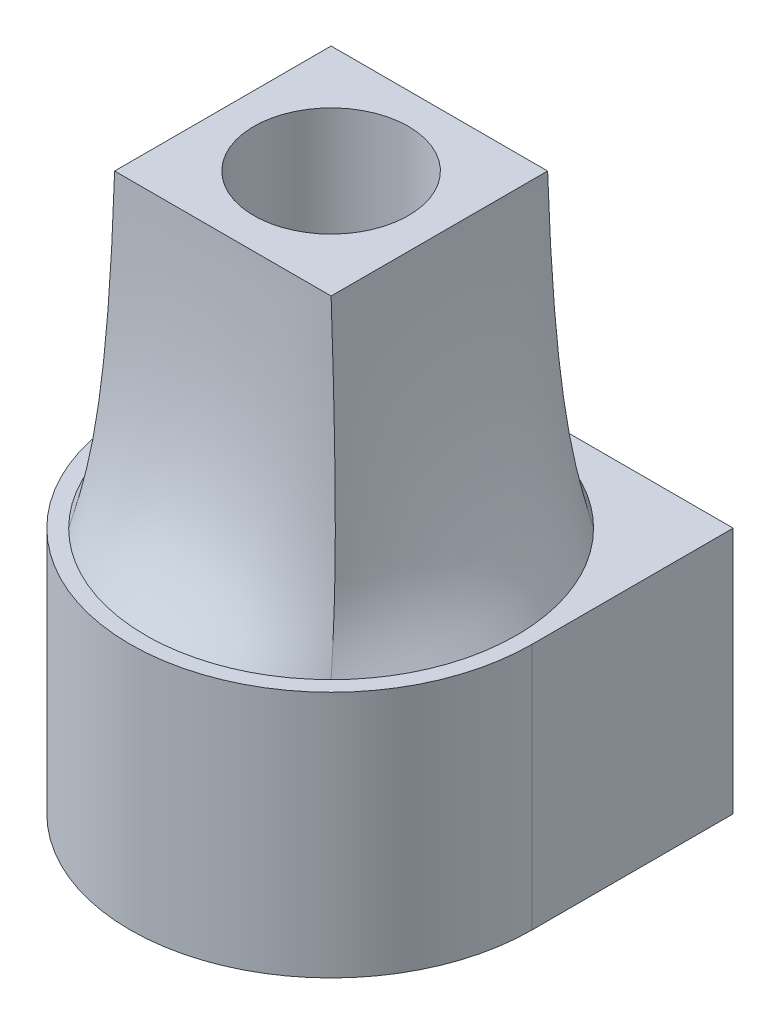
ISO-10303-21;
HEADER;
FILE_DESCRIPTION(('STEP AP214'),'2;1');
FILE_NAME('part.step','',(''),(''),'','','');
FILE_SCHEMA(('AUTOMOTIVE_DESIGN { 1 0 10303 214 1 1 1 1 }'));
ENDSEC;
DATA;
#1=APPLICATION_CONTEXT('core data for automotive mechanical design processes');
#2=APPLICATION_PROTOCOL_DEFINITION('international standard','automotive_design',2000,#1);
#3=PRODUCT_CONTEXT('',#1,'mechanical');
#4=PRODUCT('Part','Part','',(#3));
#5=PRODUCT_RELATED_PRODUCT_CATEGORY('part','',(#4));
#6=PRODUCT_DEFINITION_FORMATION('','',#4);
#7=PRODUCT_DEFINITION_CONTEXT('part definition',#1,'design');
#8=PRODUCT_DEFINITION('design','',#6,#7);
#9=PRODUCT_DEFINITION_SHAPE('','',#8);
#10=(LENGTH_UNIT() NAMED_UNIT(*) SI_UNIT(.MILLI.,.METRE.));
#11=(NAMED_UNIT(*) PLANE_ANGLE_UNIT() SI_UNIT($,.RADIAN.));
#12=(NAMED_UNIT(*) SI_UNIT($,.STERADIAN.) SOLID_ANGLE_UNIT());
#13=UNCERTAINTY_MEASURE_WITH_UNIT(LENGTH_MEASURE(1.E-05),#10,'distance_accuracy_value','');
#14=(GEOMETRIC_REPRESENTATION_CONTEXT(3) GLOBAL_UNCERTAINTY_ASSIGNED_CONTEXT((#13)) GLOBAL_UNIT_ASSIGNED_CONTEXT((#10,
#11,#12)) REPRESENTATION_CONTEXT('',''));
#15=CARTESIAN_POINT('',(0.,0.,0.));
#16=DIRECTION('',(0.,0.,1.));
#17=DIRECTION('',(1.,0.,0.));
#18=AXIS2_PLACEMENT_3D('',#15,#16,#17);
#19=CARTESIAN_POINT('',(0.,4.,0.));
#20=DIRECTION('',(0.,1.,0.));
#21=DIRECTION('',(0.,0.,1.));
#22=AXIS2_PLACEMENT_3D('',#19,#20,#21);
#23=PLANE('',#22);
#24=CARTESIAN_POINT('',(0.,4.,0.));
#25=DIRECTION('',(0.,1.,0.));
#26=DIRECTION('',(0.,0.,1.));
#27=AXIS2_PLACEMENT_3D('',#24,#25,#26);
#28=CIRCLE('',#27,6.5);
#29=CARTESIAN_POINT('',(-6.5,4.,0.));
#30=VERTEX_POINT('',#29);
#31=CARTESIAN_POINT('',(6.5,4.,0.));
#32=VERTEX_POINT('',#31);
#33=EDGE_CURVE('E317',#30,#32,#28,.T.);
#34=ORIENTED_EDGE('',*,*,#33,.T.);
#35=DIRECTION('',(0.,0.,-1.));
#36=VECTOR('',#35,1.);
#37=CARTESIAN_POINT('',(6.5,4.,-6.5));
#38=LINE('',#37,#36);
#39=CARTESIAN_POINT('',(6.5,4.,-6.5));
#40=VERTEX_POINT('',#39);
#41=EDGE_CURVE('E342',#32,#40,#38,.T.);
#42=ORIENTED_EDGE('',*,*,#41,.T.);
#43=DIRECTION('',(-1.,0.,0.));
#44=VECTOR('',#43,1.);
#45=CARTESIAN_POINT('',(-6.5,4.,-6.5));
#46=LINE('',#45,#44);
#47=CARTESIAN_POINT('',(-6.5,4.,-6.5));
#48=VERTEX_POINT('',#47);
#49=EDGE_CURVE('E345',#40,#48,#46,.T.);
#50=ORIENTED_EDGE('',*,*,#49,.T.);
#51=DIRECTION('',(0.,0.,1.));
#52=VECTOR('',#51,1.);
#53=CARTESIAN_POINT('',(-6.5,4.,0.));
#54=LINE('',#53,#52);
#55=EDGE_CURVE('E330',#48,#30,#54,.T.);
#56=ORIENTED_EDGE('',*,*,#55,.T.);
#57=EDGE_LOOP('',(#34,#42,#50,#56));
#58=FACE_BOUND('',#57,.T.);
#59=CARTESIAN_POINT('',(4.24264068711929,4.,-4.24264068711929));
#60=CARTESIAN_POINT('',(4.17797988257539,4.,-4.30730275832313));
#61=CARTESIAN_POINT('',(4.11187599592558,4.,-4.37050525337732));
#62=CARTESIAN_POINT('',(3.97687708274893,4.,-4.49385922301948));
#63=CARTESIAN_POINT('',(3.90798197428672,4.,-4.55401060792623));
#64=CARTESIAN_POINT('',(3.69728318746953,4.,-4.72966386887627));
#65=CARTESIAN_POINT('',(3.55144296733771,4.,-4.84038795773824));
#66=CARTESIAN_POINT('',(3.25056248268807,4.,-5.04772655806844));
#67=CARTESIAN_POINT('',(3.09554327469543,4.,-5.14437172769514));
#68=CARTESIAN_POINT('',(2.77728982974957,4.,-5.32299862847432));
#69=CARTESIAN_POINT('',(2.61405673402255,4.,-5.40498238949411));
#70=CARTESIAN_POINT('',(2.2935756169739,4.,-5.54790613847813));
#71=CARTESIAN_POINT('',(2.13683112572997,4.,-5.60997890349763));
#72=CARTESIAN_POINT('',(1.81860230187122,4.,-5.72068526496489));
#73=CARTESIAN_POINT('',(1.65711635010991,4.,-5.76931421006599));
#74=CARTESIAN_POINT('',(1.33070513106173,4.,-5.85279249938873));
#75=CARTESIAN_POINT('',(1.16578151632958,4.,-5.88764831082636));
#76=CARTESIAN_POINT('',(0.833536503824211,4.,-5.94343103240205));
#77=CARTESIAN_POINT('',(0.666214281624086,4.,-5.96435303009892));
#78=CARTESIAN_POINT('',(0.330281351729198,4.,-5.99214924522685));
#79=CARTESIAN_POINT('',(0.161669771618736,4.,-5.99901291274262));
#80=CARTESIAN_POINT('',(-0.17553722025101,4.,-5.99862612354731));
#81=CARTESIAN_POINT('',(-0.344132632003875,4.,-5.99137566125577));
#82=CARTESIAN_POINT('',(-0.680190313431393,4.,-5.96279199732046));
#83=CARTESIAN_POINT('',(-0.847652132360266,4.,-5.94145349210646));
#84=CARTESIAN_POINT('',(-1.18013733836632,4.,-5.88481065642094));
#85=CARTESIAN_POINT('',(-1.34516156122826,4.,-5.84951123375555));
#86=CARTESIAN_POINT('',(-1.67277881060023,4.,-5.76485099068784));
#87=CARTESIAN_POINT('',(-1.83534727070238,4.,-5.71539501660963));
#88=CARTESIAN_POINT('',(-2.15562370541345,4.,-5.60284362154622));
#89=CARTESIAN_POINT('',(-2.31333348579889,4.,-5.53975333949847));
#90=CARTESIAN_POINT('',(-2.62272325527448,4.,-5.400365320367));
#91=CARTESIAN_POINT('',(-2.77440594793895,4.,-5.32407358921695));
#92=CARTESIAN_POINT('',(-3.07064143570779,4.,-5.1588434884827));
#93=CARTESIAN_POINT('',(-3.21519644208397,4.,-5.06990907479937));
#94=CARTESIAN_POINT('',(-3.51492948247273,4.,-4.86738038581654));
#95=CARTESIAN_POINT('',(-3.6689626010608,4.,-4.75207948298825));
#96=CARTESIAN_POINT('',(-3.89103014761557,4.,-4.5686228923953));
#97=CARTESIAN_POINT('',(-3.96350928670545,4.,-4.50576624191327));
#98=CARTESIAN_POINT('',(-4.10540121178893,4.,-4.37668890572828));
#99=CARTESIAN_POINT('',(-4.17481415236434,4.,-4.31046838997667));
#100=CARTESIAN_POINT('',(-4.24264068711929,4.,-4.24264068711929));
#101=B_SPLINE_CURVE_WITH_KNOTS('',3,(#59,#60,#61,#62,#63,#64,#65,#66,#67,#68,#69,#70,#71,#72,
#73,#74,#75,#76,#77,#78,#79,#80,#81,#82,#83,#84,#85,#86,#87,#88,#89,#90,#91,#92,#93,#94,#95,#96,
#97,#98,#99,#100),.UNSPECIFIED.,.F.,.F.,(4,2,2,2,2,2,2,2,2,2,2,2,2,2,2,2,2,2,2,2,4),(0.,
0.274288051777837,0.54858416103207,1.09707876730845,1.64436052475757,2.19156645246337,
2.69673561954097,3.20207934895461,3.70718550993958,4.2124696546894,4.71813284550407,
5.22379623624833,5.72965009714355,6.23532628854488,6.74448459166645,7.25345132046376,
7.76218710325412,8.27076405134778,8.84699533931879,9.13471897796047,9.42242809447555),.UNSPECIFIED.);
#102=CARTESIAN_POINT('',(4.24264068711929,4.,-4.24264068711929));
#103=VERTEX_POINT('',#102);
#104=CARTESIAN_POINT('',(-4.24264068711929,4.,-4.24264068711929));
#105=VERTEX_POINT('',#104);
#106=EDGE_CURVE('E361',#103,#105,#101,.T.);
#107=ORIENTED_EDGE('',*,*,#106,.F.);
#108=CARTESIAN_POINT('',(4.24264068711929,4.,4.24264068711929));
#109=CARTESIAN_POINT('',(4.30730275832313,4.,4.17797988257539));
#110=CARTESIAN_POINT('',(4.37050525337732,4.,4.11187599592558));
#111=CARTESIAN_POINT('',(4.49385922301947,4.,3.97687708274894));
#112=CARTESIAN_POINT('',(4.55401060792623,4.,3.90798197428672));
#113=CARTESIAN_POINT('',(4.72966386887627,4.,3.69728318746953));
#114=CARTESIAN_POINT('',(4.84038795773824,4.,3.55144296733771));
#115=CARTESIAN_POINT('',(5.04772655806844,4.,3.25056248268807));
#116=CARTESIAN_POINT('',(5.14437172769513,4.,3.09554327469544));
#117=CARTESIAN_POINT('',(5.32299862847431,4.,2.77728982974958));
#118=CARTESIAN_POINT('',(5.40498238949411,4.,2.61405673402256));
#119=CARTESIAN_POINT('',(5.54790613847813,4.,2.29357561697391));
#120=CARTESIAN_POINT('',(5.60997890349763,4.,2.13683112572997));
#121=CARTESIAN_POINT('',(5.72068526496489,4.,1.81860230187123));
#122=CARTESIAN_POINT('',(5.76931421006599,4.,1.65711635010992));
#123=CARTESIAN_POINT('',(5.85279249938872,4.,1.33070513106173));
#124=CARTESIAN_POINT('',(5.88764831082636,4.,1.16578151632958));
#125=CARTESIAN_POINT('',(5.94343103240205,4.,0.833536503824217));
#126=CARTESIAN_POINT('',(5.96435303009891,4.,0.666214281624092));
#127=CARTESIAN_POINT('',(5.99214924522685,4.,0.330281351729205));
#128=CARTESIAN_POINT('',(5.99901291274263,4.,0.161669771618743));
#129=CARTESIAN_POINT('',(5.99862612354731,4.,-0.175537220251002));
#130=CARTESIAN_POINT('',(5.99137566125577,4.,-0.344132632003866));
#131=CARTESIAN_POINT('',(5.96279199732046,4.,-0.680190313431383));
#132=CARTESIAN_POINT('',(5.94145349210646,4.,-0.847652132360256));
#133=CARTESIAN_POINT('',(5.88481065642095,4.,-1.18013733836631));
#134=CARTESIAN_POINT('',(5.84951123375555,4.,-1.34516156122825));
#135=CARTESIAN_POINT('',(5.76485099068784,4.,-1.67277881060023));
#136=CARTESIAN_POINT('',(5.71539501660964,4.,-1.83534727070237));
#137=CARTESIAN_POINT('',(5.60284362154623,4.,-2.15562370541345));
#138=CARTESIAN_POINT('',(5.53975333949847,4.,-2.31333348579889));
#139=CARTESIAN_POINT('',(5.40036532036699,4.,-2.62272325527449));
#140=CARTESIAN_POINT('',(5.32407358921694,4.,-2.77440594793896));
#141=CARTESIAN_POINT('',(5.15884348848269,4.,-3.0706414357078));
#142=CARTESIAN_POINT('',(5.06990907479936,4.,-3.21519644208399));
#143=CARTESIAN_POINT('',(4.86738038581653,4.,-3.51492948247275));
#144=CARTESIAN_POINT('',(4.75207948298824,4.,-3.66896260106081));
#145=CARTESIAN_POINT('',(4.56862289239529,4.,-3.89103014761558));
#146=CARTESIAN_POINT('',(4.50576624191326,4.,-3.96350928670546));
#147=CARTESIAN_POINT('',(4.37668890572828,4.,-4.10540121178894));
#148=CARTESIAN_POINT('',(4.31046838997666,4.,-4.17481415236434));
#149=CARTESIAN_POINT('',(4.24264068711929,4.,-4.24264068711929));
#150=B_SPLINE_CURVE_WITH_KNOTS('',3,(#108,#109,#110,#111,#112,#113,#114,#115,#116,#117,#118,
#119,#120,#121,#122,#123,#124,#125,#126,#127,#128,#129,#130,#131,#132,#133,#134,#135,#136,#137,
#138,#139,#140,#141,#142,#143,#144,#145,#146,#147,#148,#149),.UNSPECIFIED.,.F.,.F.,(4,2,2,2,2,2,
2,2,2,2,2,2,2,2,2,2,2,2,2,2,4),(0.,0.274288051777836,0.548584161032068,1.09707876730845,
1.64436052475757,2.19156645246336,2.69673561954097,3.2020793489546,3.70718550993958,
4.2124696546894,4.71813284550407,5.22379623624832,5.72965009714354,6.23532628854487,
6.74448459166645,7.25345132046376,7.76218710325414,8.27076405134781,8.8469953393188,
9.13471897796047,9.42242809447556),.UNSPECIFIED.);
#151=CARTESIAN_POINT('',(4.24264068711929,4.,4.24264068711929));
#152=VERTEX_POINT('',#151);
#153=EDGE_CURVE('E127',#152,#103,#150,.T.);
#154=ORIENTED_EDGE('',*,*,#153,.F.);
#155=CARTESIAN_POINT('',(-4.24264068711929,4.,4.24264068711928));
#156=CARTESIAN_POINT('',(-4.17797988257539,4.,4.30730275832313));
#157=CARTESIAN_POINT('',(-4.11187599592558,4.,4.37050525337732));
#158=CARTESIAN_POINT('',(-3.97687708274893,4.,4.49385922301947));
#159=CARTESIAN_POINT('',(-3.90798197428672,4.,4.55401060792623));
#160=CARTESIAN_POINT('',(-3.69728318746953,4.,4.72966386887627));
#161=CARTESIAN_POINT('',(-3.55144296733771,4.,4.84038795773824));
#162=CARTESIAN_POINT('',(-3.25056248268807,4.,5.04772655806844));
#163=CARTESIAN_POINT('',(-3.09554327469543,4.,5.14437172769513));
#164=CARTESIAN_POINT('',(-2.77728982974957,4.,5.32299862847431));
#165=CARTESIAN_POINT('',(-2.61405673402255,4.,5.40498238949411));
#166=CARTESIAN_POINT('',(-2.2935756169739,4.,5.54790613847813));
#167=CARTESIAN_POINT('',(-2.13683112572997,4.,5.60997890349763));
#168=CARTESIAN_POINT('',(-1.81860230187122,4.,5.72068526496489));
#169=CARTESIAN_POINT('',(-1.65711635010991,4.,5.76931421006599));
#170=CARTESIAN_POINT('',(-1.33070513106173,4.,5.85279249938872));
#171=CARTESIAN_POINT('',(-1.16578151632958,4.,5.88764831082636));
#172=CARTESIAN_POINT('',(-0.833536503824211,4.,5.94343103240205));
#173=CARTESIAN_POINT('',(-0.666214281624085,4.,5.96435303009891));
#174=CARTESIAN_POINT('',(-0.330281351729199,4.,5.99214924522685));
#175=CARTESIAN_POINT('',(-0.161669771618737,4.,5.99901291274262));
#176=CARTESIAN_POINT('',(0.175537220251008,4.,5.99862612354731));
#177=CARTESIAN_POINT('',(0.344132632003872,4.,5.99137566125577));
#178=CARTESIAN_POINT('',(0.680190313431389,4.,5.96279199732046));
#179=CARTESIAN_POINT('',(0.847652132360261,4.,5.94145349210646));
#180=CARTESIAN_POINT('',(1.18013733836631,4.,5.88481065642094));
#181=CARTESIAN_POINT('',(1.34516156122825,4.,5.84951123375555));
#182=CARTESIAN_POINT('',(1.67277881060023,4.,5.76485099068784));
#183=CARTESIAN_POINT('',(1.83534727070237,4.,5.71539501660963));
#184=CARTESIAN_POINT('',(2.15562370541345,4.,5.60284362154622));
#185=CARTESIAN_POINT('',(2.31333348579888,4.,5.53975333949846));
#186=CARTESIAN_POINT('',(2.62272325527448,4.,5.40036532036699));
#187=CARTESIAN_POINT('',(2.77440594793895,4.,5.32407358921695));
#188=CARTESIAN_POINT('',(3.07064143570779,4.,5.1588434884827));
#189=CARTESIAN_POINT('',(3.21519644208398,4.,5.06990907479937));
#190=CARTESIAN_POINT('',(3.51492948247273,4.,4.86738038581654));
#191=CARTESIAN_POINT('',(3.6689626010608,4.,4.75207948298825));
#192=CARTESIAN_POINT('',(3.89103014761557,4.,4.5686228923953));
#193=CARTESIAN_POINT('',(3.96350928670545,4.,4.50576624191327));
#194=CARTESIAN_POINT('',(4.10540121178893,4.,4.37668890572828));
#195=CARTESIAN_POINT('',(4.17481415236434,4.,4.31046838997667));
#196=CARTESIAN_POINT('',(4.24264068711928,4.,4.24264068711929));
#197=B_SPLINE_CURVE_WITH_KNOTS('',3,(#155,#156,#157,#158,#159,#160,#161,#162,#163,#164,#165,
#166,#167,#168,#169,#170,#171,#172,#173,#174,#175,#176,#177,#178,#179,#180,#181,#182,#183,#184,
#185,#186,#187,#188,#189,#190,#191,#192,#193,#194,#195,#196),.UNSPECIFIED.,.F.,.F.,(4,2,2,2,2,2,
2,2,2,2,2,2,2,2,2,2,2,2,2,2,4),(0.,0.274288051777838,0.54858416103207,1.09707876730845,
1.64436052475757,2.19156645246337,2.69673561954097,3.20207934895461,3.70718550993958,
4.2124696546894,4.71813284550407,5.22379623624833,5.72965009714354,6.23532628854488,
6.74448459166645,7.25345132046376,7.76218710325413,8.27076405134779,8.84699533931879,
9.13471897796047,9.42242809447555),.UNSPECIFIED.);
#198=CARTESIAN_POINT('',(-4.24264068711929,4.,4.24264068711929));
#199=VERTEX_POINT('',#198);
#200=EDGE_CURVE('E362',#199,#152,#197,.T.);
#201=ORIENTED_EDGE('',*,*,#200,.F.);
#202=CARTESIAN_POINT('',(-4.24264068711929,4.,-4.24264068711929));
#203=CARTESIAN_POINT('',(-4.30730275832313,4.,-4.17797988257539));
#204=CARTESIAN_POINT('',(-4.37050525337732,4.,-4.11187599592558));
#205=CARTESIAN_POINT('',(-4.49385922301948,4.,-3.97687708274893));
#206=CARTESIAN_POINT('',(-4.55401060792623,4.,-3.90798197428672));
#207=CARTESIAN_POINT('',(-4.72966386887627,4.,-3.69728318746953));
#208=CARTESIAN_POINT('',(-4.84038795773824,4.,-3.55144296733771));
#209=CARTESIAN_POINT('',(-5.04772655806844,4.,-3.25056248268807));
#210=CARTESIAN_POINT('',(-5.14437172769514,4.,-3.09554327469543));
#211=CARTESIAN_POINT('',(-5.32299862847432,4.,-2.77728982974957));
#212=CARTESIAN_POINT('',(-5.40498238949411,4.,-2.61405673402255));
#213=CARTESIAN_POINT('',(-5.54790613847813,4.,-2.2935756169739));
#214=CARTESIAN_POINT('',(-5.60997890349763,4.,-2.13683112572997));
#215=CARTESIAN_POINT('',(-5.72068526496489,4.,-1.81860230187122));
#216=CARTESIAN_POINT('',(-5.76931421006599,4.,-1.65711635010991));
#217=CARTESIAN_POINT('',(-5.85279249938873,4.,-1.33070513106173));
#218=CARTESIAN_POINT('',(-5.88764831082636,4.,-1.16578151632958));
#219=CARTESIAN_POINT('',(-5.94343103240205,4.,-0.833536503824211));
#220=CARTESIAN_POINT('',(-5.96435303009892,4.,-0.666214281624086));
#221=CARTESIAN_POINT('',(-5.99214924522685,4.,-0.330281351729199));
#222=CARTESIAN_POINT('',(-5.99901291274262,4.,-0.161669771618736));
#223=CARTESIAN_POINT('',(-5.99862612354731,4.,0.175537220251011));
#224=CARTESIAN_POINT('',(-5.99137566125577,4.,0.344132632003875));
#225=CARTESIAN_POINT('',(-5.96279199732046,4.,0.680190313431393));
#226=CARTESIAN_POINT('',(-5.94145349210646,4.,0.847652132360266));
#227=CARTESIAN_POINT('',(-5.88481065642094,4.,1.18013733836632));
#228=CARTESIAN_POINT('',(-5.84951123375555,4.,1.34516156122826));
#229=CARTESIAN_POINT('',(-5.76485099068784,4.,1.67277881060023));
#230=CARTESIAN_POINT('',(-5.71539501660963,4.,1.83534727070238));
#231=CARTESIAN_POINT('',(-5.60284362154622,4.,2.15562370541345));
#232=CARTESIAN_POINT('',(-5.53975333949847,4.,2.31333348579889));
#233=CARTESIAN_POINT('',(-5.400365320367,4.,2.62272325527448));
#234=CARTESIAN_POINT('',(-5.32407358921695,4.,2.77440594793895));
#235=CARTESIAN_POINT('',(-5.1588434884827,4.,3.07064143570779));
#236=CARTESIAN_POINT('',(-5.06990907479937,4.,3.21519644208397));
#237=CARTESIAN_POINT('',(-4.86738038581654,4.,3.51492948247273));
#238=CARTESIAN_POINT('',(-4.75207948298825,4.,3.6689626010608));
#239=CARTESIAN_POINT('',(-4.56862289239531,4.,3.89103014761557));
#240=CARTESIAN_POINT('',(-4.50576624191327,4.,3.96350928670545));
#241=CARTESIAN_POINT('',(-4.37668890572828,4.,4.10540121178893));
#242=CARTESIAN_POINT('',(-4.31046838997667,4.,4.17481415236434));
#243=CARTESIAN_POINT('',(-4.24264068711929,4.,4.24264068711929));
#244=B_SPLINE_CURVE_WITH_KNOTS('',3,(#202,#203,#204,#205,#206,#207,#208,#209,#210,#211,#212,
#213,#214,#215,#216,#217,#218,#219,#220,#221,#222,#223,#224,#225,#226,#227,#228,#229,#230,#231,
#232,#233,#234,#235,#236,#237,#238,#239,#240,#241,#242,#243),.UNSPECIFIED.,.F.,.F.,(4,2,2,2,2,2,
2,2,2,2,2,2,2,2,2,2,2,2,2,2,4),(0.,0.274288051777837,0.54858416103207,1.09707876730845,
1.64436052475757,2.19156645246337,2.69673561954097,3.20207934895461,3.70718550993958,
4.2124696546894,4.71813284550407,5.22379623624833,5.72965009714355,6.23532628854488,
6.74448459166645,7.25345132046376,7.76218710325412,8.27076405134778,8.84699533931879,
9.13471897796047,9.42242809447555),.UNSPECIFIED.);
#245=EDGE_CURVE('E210',#105,#199,#244,.T.);
#246=ORIENTED_EDGE('',*,*,#245,.F.);
#247=EDGE_LOOP('',(#107,#154,#201,#246));
#248=FACE_BOUND('',#247,.T.);
#249=ADVANCED_FACE('F109',(#58,#248),#23,.T.);
#250=CARTESIAN_POINT('',(-6.5,-4.,-6.5));
#251=DIRECTION('',(0.,0.,-1.));
#252=DIRECTION('',(-1.,0.,0.));
#253=AXIS2_PLACEMENT_3D('',#250,#251,#252);
#254=PLANE('',#253);
#255=ORIENTED_EDGE('',*,*,#49,.F.);
#256=DIRECTION('',(0.,1.,0.));
#257=VECTOR('',#256,1.);
#258=CARTESIAN_POINT('',(6.5,-4.,-6.5));
#259=LINE('',#258,#257);
#260=CARTESIAN_POINT('',(6.5,-4.,-6.5));
#261=VERTEX_POINT('',#260);
#262=EDGE_CURVE('E351',#261,#40,#259,.T.);
#263=ORIENTED_EDGE('',*,*,#262,.F.);
#264=DIRECTION('',(-1.,0.,0.));
#265=VECTOR('',#264,1.);
#266=CARTESIAN_POINT('',(-6.5,-4.,-6.5));
#267=LINE('',#266,#265);
#268=CARTESIAN_POINT('',(-6.5,-4.,-6.5));
#269=VERTEX_POINT('',#268);
#270=EDGE_CURVE('E333',#261,#269,#267,.T.);
#271=ORIENTED_EDGE('',*,*,#270,.T.);
#272=DIRECTION('',(0.,1.,0.));
#273=VECTOR('',#272,1.);
#274=CARTESIAN_POINT('',(-6.5,-4.,-6.5));
#275=LINE('',#274,#273);
#276=EDGE_CURVE('E119',#269,#48,#275,.T.);
#277=ORIENTED_EDGE('',*,*,#276,.T.);
#278=EDGE_LOOP('',(#255,#263,#271,#277));
#279=FACE_BOUND('',#278,.T.);
#280=DIRECTION('',(0.,1.,0.));
#281=VECTOR('',#280,1.);
#282=CARTESIAN_POINT('',(-3.75,-1.75,-6.5));
#283=LINE('',#282,#281);
#284=CARTESIAN_POINT('',(-3.75,-1.75,-6.5));
#285=VERTEX_POINT('',#284);
#286=CARTESIAN_POINT('',(-3.75,1.75,-6.5));
#287=VERTEX_POINT('',#286);
#288=EDGE_CURVE('E299',#285,#287,#283,.T.);
#289=ORIENTED_EDGE('',*,*,#288,.F.);
#290=DIRECTION('',(-1.,0.,0.));
#291=VECTOR('',#290,1.);
#292=CARTESIAN_POINT('',(-3.75,-1.75,-6.5));
#293=LINE('',#292,#291);
#294=CARTESIAN_POINT('',(3.75,-1.75,-6.5));
#295=VERTEX_POINT('',#294);
#296=EDGE_CURVE('E280',#295,#285,#293,.T.);
#297=ORIENTED_EDGE('',*,*,#296,.F.);
#298=DIRECTION('',(0.,1.,0.));
#299=VECTOR('',#298,1.);
#300=CARTESIAN_POINT('',(3.75,-1.75,-6.5));
#301=LINE('',#300,#299);
#302=CARTESIAN_POINT('',(3.75,1.75,-6.5));
#303=VERTEX_POINT('',#302);
#304=EDGE_CURVE('E314',#295,#303,#301,.T.);
#305=ORIENTED_EDGE('',*,*,#304,.T.);
#306=DIRECTION('',(-1.,0.,0.));
#307=VECTOR('',#306,1.);
#308=CARTESIAN_POINT('',(-3.75,1.75,-6.5));
#309=LINE('',#308,#307);
#310=EDGE_CURVE('E300',#303,#287,#309,.T.);
#311=ORIENTED_EDGE('',*,*,#310,.T.);
#312=EDGE_LOOP('',(#289,#297,#305,#311));
#313=FACE_BOUND('',#312,.T.);
#314=ADVANCED_FACE('F475',(#279,#313),#254,.T.);
#315=CARTESIAN_POINT('',(0.,-4.,0.));
#316=DIRECTION('',(0.,1.,0.));
#317=DIRECTION('',(0.,0.,1.));
#318=AXIS2_PLACEMENT_3D('',#315,#316,#317);
#319=CYLINDRICAL_SURFACE('',#318,6.5);
#320=ORIENTED_EDGE('',*,*,#33,.F.);
#321=DIRECTION('',(0.,1.,0.));
#322=VECTOR('',#321,1.);
#323=CARTESIAN_POINT('',(-6.5,-4.,0.));
#324=LINE('',#323,#322);
#325=CARTESIAN_POINT('',(-6.5,-4.,0.));
#326=VERTEX_POINT('',#325);
#327=EDGE_CURVE('E12',#326,#30,#324,.T.);
#328=ORIENTED_EDGE('',*,*,#327,.F.);
#329=CARTESIAN_POINT('',(0.,-4.,0.));
#330=DIRECTION('',(0.,1.,0.));
#331=DIRECTION('',(0.,0.,1.));
#332=AXIS2_PLACEMENT_3D('',#329,#330,#331);
#333=CIRCLE('',#332,6.5);
#334=CARTESIAN_POINT('',(6.5,-4.,0.));
#335=VERTEX_POINT('',#334);
#336=EDGE_CURVE('E326',#326,#335,#333,.T.);
#337=ORIENTED_EDGE('',*,*,#336,.T.);
#338=DIRECTION('',(0.,1.,0.));
#339=VECTOR('',#338,1.);
#340=CARTESIAN_POINT('',(6.5,-4.,0.));
#341=LINE('',#340,#339);
#342=EDGE_CURVE('E339',#335,#32,#341,.T.);
#343=ORIENTED_EDGE('',*,*,#342,.T.);
#344=EDGE_LOOP('',(#320,#328,#337,#343));
#345=FACE_BOUND('',#344,.T.);
#346=ADVANCED_FACE('F111',(#345),#319,.T.);
#347=CARTESIAN_POINT('',(-6.5,-4.,0.));
#348=DIRECTION('',(-1.,0.,0.));
#349=DIRECTION('',(0.,0.,1.));
#350=AXIS2_PLACEMENT_3D('',#347,#348,#349);
#351=PLANE('',#350);
#352=ORIENTED_EDGE('',*,*,#55,.F.);
#353=ORIENTED_EDGE('',*,*,#276,.F.);
#354=DIRECTION('',(0.,0.,1.));
#355=VECTOR('',#354,1.);
#356=CARTESIAN_POINT('',(-6.5,-4.,0.));
#357=LINE('',#356,#355);
#358=EDGE_CURVE('E336',#269,#326,#357,.T.);
#359=ORIENTED_EDGE('',*,*,#358,.T.);
#360=ORIENTED_EDGE('',*,*,#327,.T.);
#361=EDGE_LOOP('',(#352,#353,#359,#360));
#362=FACE_BOUND('',#361,.T.);
#363=ADVANCED_FACE('F494',(#362),#351,.T.);
#364=CARTESIAN_POINT('',(6.5,-4.,-6.5));
#365=DIRECTION('',(1.,0.,0.));
#366=DIRECTION('',(0.,0.,-1.));
#367=AXIS2_PLACEMENT_3D('',#364,#365,#366);
#368=PLANE('',#367);
#369=ORIENTED_EDGE('',*,*,#41,.F.);
#370=ORIENTED_EDGE('',*,*,#342,.F.);
#371=DIRECTION('',(0.,0.,-1.));
#372=VECTOR('',#371,1.);
#373=CARTESIAN_POINT('',(6.5,-4.,-6.5));
#374=LINE('',#373,#372);
#375=EDGE_CURVE('E329',#335,#261,#374,.T.);
#376=ORIENTED_EDGE('',*,*,#375,.T.);
#377=ORIENTED_EDGE('',*,*,#262,.T.);
#378=EDGE_LOOP('',(#369,#370,#376,#377));
#379=FACE_BOUND('',#378,.T.);
#380=ADVANCED_FACE('F489',(#379),#368,.T.);
#381=CARTESIAN_POINT('',(0.,-4.,0.));
#382=DIRECTION('',(0.,1.,0.));
#383=DIRECTION('',(0.,0.,1.));
#384=AXIS2_PLACEMENT_3D('',#381,#382,#383);
#385=PLANE('',#384);
#386=CARTESIAN_POINT('',(0.,-4.,0.));
#387=DIRECTION('',(0.,-1.,0.));
#388=DIRECTION('',(0.,0.,-1.));
#389=AXIS2_PLACEMENT_3D('',#386,#387,#388);
#390=CIRCLE('',#389,2.5);
#391=CARTESIAN_POINT('',(0.,-4.,-2.5));
#392=VERTEX_POINT('',#391);
#393=EDGE_CURVE('E546',#392,#392,#390,.T.);
#394=ORIENTED_EDGE('',*,*,#393,.F.);
#395=EDGE_LOOP('',(#394));
#396=FACE_BOUND('',#395,.T.);
#397=ORIENTED_EDGE('',*,*,#336,.F.);
#398=ORIENTED_EDGE('',*,*,#358,.F.);
#399=ORIENTED_EDGE('',*,*,#270,.F.);
#400=ORIENTED_EDGE('',*,*,#375,.F.);
#401=EDGE_LOOP('',(#397,#398,#399,#400));
#402=FACE_BOUND('',#401,.T.);
#403=ADVANCED_FACE('F497',(#396,#402),#385,.F.);
#404=CARTESIAN_POINT('',(3.75,-1.75,-2.1650635094611));
#405=DIRECTION('',(1.,0.,0.));
#406=DIRECTION('',(0.,0.,-1.));
#407=AXIS2_PLACEMENT_3D('',#404,#405,#406);
#408=PLANE('',#407);
#409=DIRECTION('',(0.,0.,-1.));
#410=VECTOR('',#409,1.);
#411=CARTESIAN_POINT('',(3.75,1.75,-2.1650635094611));
#412=LINE('',#411,#410);
#413=CARTESIAN_POINT('',(3.75,1.75,2.1650635094611));
#414=VERTEX_POINT('',#413);
#415=EDGE_CURVE('E289',#414,#303,#412,.T.);
#416=ORIENTED_EDGE('',*,*,#415,.T.);
#417=ORIENTED_EDGE('',*,*,#304,.F.);
#418=DIRECTION('',(0.,0.,-1.));
#419=VECTOR('',#418,1.);
#420=CARTESIAN_POINT('',(3.75,-1.75,2.1650635094611));
#421=LINE('',#420,#419);
#422=CARTESIAN_POINT('',(3.75,-1.75,2.1650635094611));
#423=VERTEX_POINT('',#422);
#424=EDGE_CURVE('E297',#423,#295,#421,.T.);
#425=ORIENTED_EDGE('',*,*,#424,.F.);
#426=DIRECTION('',(0.,1.,0.));
#427=VECTOR('',#426,1.);
#428=CARTESIAN_POINT('',(3.75,-1.75,2.1650635094611));
#429=LINE('',#428,#427);
#430=EDGE_CURVE('E318',#423,#414,#429,.T.);
#431=ORIENTED_EDGE('',*,*,#430,.T.);
#432=EDGE_LOOP('',(#416,#417,#425,#431));
#433=FACE_BOUND('',#432,.T.);
#434=ADVANCED_FACE('F499',(#433),#408,.F.);
#435=CARTESIAN_POINT('',(0.,-1.75,4.3301270189222));
#436=DIRECTION('',(0.5,0.,0.866025403784439));
#437=DIRECTION('',(0.866025403784439,0.,-0.5));
#438=AXIS2_PLACEMENT_3D('',#435,#436,#437);
#439=PLANE('',#438);
#440=DIRECTION('',(0.866025403784439,0.,-0.5));
#441=VECTOR('',#440,1.);
#442=CARTESIAN_POINT('',(0.,1.75,4.3301270189222));
#443=LINE('',#442,#441);
#444=CARTESIAN_POINT('',(0.,1.75,4.3301270189222));
#445=VERTEX_POINT('',#444);
#446=EDGE_CURVE('E309',#445,#414,#443,.T.);
#447=ORIENTED_EDGE('',*,*,#446,.T.);
#448=ORIENTED_EDGE('',*,*,#430,.F.);
#449=DIRECTION('',(0.866025403784439,0.,-0.5));
#450=VECTOR('',#449,1.);
#451=CARTESIAN_POINT('',(0.,-1.75,4.3301270189222));
#452=LINE('',#451,#450);
#453=CARTESIAN_POINT('',(0.,-1.75,4.3301270189222));
#454=VERTEX_POINT('',#453);
#455=EDGE_CURVE('E294',#454,#423,#452,.T.);
#456=ORIENTED_EDGE('',*,*,#455,.F.);
#457=DIRECTION('',(0.,1.,0.));
#458=VECTOR('',#457,1.);
#459=CARTESIAN_POINT('',(0.,-1.75,4.3301270189222));
#460=LINE('',#459,#458);
#461=EDGE_CURVE('E321',#454,#445,#460,.T.);
#462=ORIENTED_EDGE('',*,*,#461,.T.);
#463=EDGE_LOOP('',(#447,#448,#456,#462));
#464=FACE_BOUND('',#463,.T.);
#465=ADVANCED_FACE('F505',(#464),#439,.F.);
#466=CARTESIAN_POINT('',(-3.75,-1.75,2.1650635094611));
#467=DIRECTION('',(-0.5,0.,0.866025403784439));
#468=DIRECTION('',(0.866025403784439,0.,0.5));
#469=AXIS2_PLACEMENT_3D('',#466,#467,#468);
#470=PLANE('',#469);
#471=DIRECTION('',(0.866025403784439,0.,0.5));
#472=VECTOR('',#471,1.);
#473=CARTESIAN_POINT('',(-3.75,1.75,2.1650635094611));
#474=LINE('',#473,#472);
#475=CARTESIAN_POINT('',(-3.75,1.75,2.1650635094611));
#476=VERTEX_POINT('',#475);
#477=EDGE_CURVE('E306',#476,#445,#474,.T.);
#478=ORIENTED_EDGE('',*,*,#477,.T.);
#479=ORIENTED_EDGE('',*,*,#461,.F.);
#480=DIRECTION('',(0.866025403784439,0.,0.5));
#481=VECTOR('',#480,1.);
#482=CARTESIAN_POINT('',(-3.75,-1.75,2.1650635094611));
#483=LINE('',#482,#481);
#484=CARTESIAN_POINT('',(-3.75,-1.75,2.1650635094611));
#485=VERTEX_POINT('',#484);
#486=EDGE_CURVE('E291',#485,#454,#483,.T.);
#487=ORIENTED_EDGE('',*,*,#486,.F.);
#488=DIRECTION('',(0.,1.,0.));
#489=VECTOR('',#488,1.);
#490=CARTESIAN_POINT('',(-3.75,-1.75,2.1650635094611));
#491=LINE('',#490,#489);
#492=EDGE_CURVE('E323',#485,#476,#491,.T.);
#493=ORIENTED_EDGE('',*,*,#492,.T.);
#494=EDGE_LOOP('',(#478,#479,#487,#493));
#495=FACE_BOUND('',#494,.T.);
#496=ADVANCED_FACE('F513',(#495),#470,.F.);
#497=CARTESIAN_POINT('',(-3.75,-1.75,-2.1650635094611));
#498=DIRECTION('',(-1.,0.,0.));
#499=DIRECTION('',(0.,0.,1.));
#500=AXIS2_PLACEMENT_3D('',#497,#498,#499);
#501=PLANE('',#500);
#502=DIRECTION('',(0.,0.,1.));
#503=VECTOR('',#502,1.);
#504=CARTESIAN_POINT('',(-3.75,1.75,-2.1650635094611));
#505=LINE('',#504,#503);
#506=EDGE_CURVE('E303',#287,#476,#505,.T.);
#507=ORIENTED_EDGE('',*,*,#506,.T.);
#508=ORIENTED_EDGE('',*,*,#492,.F.);
#509=DIRECTION('',(0.,0.,1.));
#510=VECTOR('',#509,1.);
#511=CARTESIAN_POINT('',(-3.75,-1.75,-2.1650635094611));
#512=LINE('',#511,#510);
#513=EDGE_CURVE('E288',#285,#485,#512,.T.);
#514=ORIENTED_EDGE('',*,*,#513,.F.);
#515=ORIENTED_EDGE('',*,*,#288,.T.);
#516=EDGE_LOOP('',(#507,#508,#514,#515));
#517=FACE_BOUND('',#516,.T.);
#518=ADVANCED_FACE('F510',(#517),#501,.F.);
#519=CARTESIAN_POINT('',(0.,-1.75,0.));
#520=DIRECTION('',(0.,1.,0.));
#521=DIRECTION('',(0.,0.,1.));
#522=AXIS2_PLACEMENT_3D('',#519,#520,#521);
#523=PLANE('',#522);
#524=CARTESIAN_POINT('',(0.,-1.75,0.));
#525=DIRECTION('',(0.,1.,0.));
#526=DIRECTION('',(0.,0.,1.));
#527=AXIS2_PLACEMENT_3D('',#524,#525,#526);
#528=CIRCLE('',#527,2.5);
#529=CARTESIAN_POINT('',(0.,-1.75,2.5));
#530=VERTEX_POINT('',#529);
#531=EDGE_CURVE('E542',#530,#530,#528,.T.);
#532=ORIENTED_EDGE('',*,*,#531,.F.);
#533=EDGE_LOOP('',(#532));
#534=FACE_BOUND('',#533,.T.);
#535=ORIENTED_EDGE('',*,*,#296,.T.);
#536=ORIENTED_EDGE('',*,*,#513,.T.);
#537=ORIENTED_EDGE('',*,*,#486,.T.);
#538=ORIENTED_EDGE('',*,*,#455,.T.);
#539=ORIENTED_EDGE('',*,*,#424,.T.);
#540=EDGE_LOOP('',(#535,#536,#537,#538,#539));
#541=FACE_BOUND('',#540,.T.);
#542=ADVANCED_FACE('F381',(#534,#541),#523,.T.);
#543=CARTESIAN_POINT('',(0.,1.75,0.));
#544=DIRECTION('',(0.,1.,0.));
#545=DIRECTION('',(0.,0.,1.));
#546=AXIS2_PLACEMENT_3D('',#543,#544,#545);
#547=PLANE('',#546);
#548=CARTESIAN_POINT('',(0.,1.75,0.));
#549=DIRECTION('',(0.,1.,0.));
#550=DIRECTION('',(0.,0.,1.));
#551=AXIS2_PLACEMENT_3D('',#548,#549,#550);
#552=CIRCLE('',#551,2.5);
#553=CARTESIAN_POINT('',(0.,1.75,2.5));
#554=VERTEX_POINT('',#553);
#555=EDGE_CURVE('E529',#554,#554,#552,.T.);
#556=ORIENTED_EDGE('',*,*,#555,.T.);
#557=EDGE_LOOP('',(#556));
#558=FACE_BOUND('',#557,.T.);
#559=ORIENTED_EDGE('',*,*,#310,.F.);
#560=ORIENTED_EDGE('',*,*,#415,.F.);
#561=ORIENTED_EDGE('',*,*,#446,.F.);
#562=ORIENTED_EDGE('',*,*,#477,.F.);
#563=ORIENTED_EDGE('',*,*,#506,.F.);
#564=EDGE_LOOP('',(#559,#560,#561,#562,#563));
#565=FACE_BOUND('',#564,.T.);
#566=ADVANCED_FACE('F250',(#558,#565),#547,.F.);
#567=CARTESIAN_POINT('',(0.,14.,0.));
#568=DIRECTION('',(0.,-1.,0.));
#569=DIRECTION('',(0.,0.,-1.));
#570=AXIS2_PLACEMENT_3D('',#567,#568,#569);
#571=PLANE('',#570);
#572=CARTESIAN_POINT('',(0.,14.,0.));
#573=DIRECTION('',(0.,-1.,0.));
#574=DIRECTION('',(0.,0.,-1.));
#575=AXIS2_PLACEMENT_3D('',#572,#573,#574);
#576=CIRCLE('',#575,2.5);
#577=CARTESIAN_POINT('',(0.,14.,-2.5));
#578=VERTEX_POINT('',#577);
#579=EDGE_CURVE('E113',#578,#578,#576,.T.);
#580=ORIENTED_EDGE('',*,*,#579,.T.);
#581=EDGE_LOOP('',(#580));
#582=FACE_BOUND('',#581,.T.);
#583=DIRECTION('',(0.,0.,-1.));
#584=VECTOR('',#583,1.);
#585=CARTESIAN_POINT('',(3.5,14.,3.5));
#586=LINE('',#585,#584);
#587=CARTESIAN_POINT('',(3.5,14.,3.5));
#588=VERTEX_POINT('',#587);
#589=CARTESIAN_POINT('',(3.5,14.,-3.5));
#590=VERTEX_POINT('',#589);
#591=EDGE_CURVE('E275',#588,#590,#586,.T.);
#592=ORIENTED_EDGE('',*,*,#591,.T.);
#593=DIRECTION('',(-1.,0.,0.));
#594=VECTOR('',#593,1.);
#595=CARTESIAN_POINT('',(-3.5,14.,-3.5));
#596=LINE('',#595,#594);
#597=CARTESIAN_POINT('',(-3.5,14.,-3.5));
#598=VERTEX_POINT('',#597);
#599=EDGE_CURVE('E230',#590,#598,#596,.T.);
#600=ORIENTED_EDGE('',*,*,#599,.T.);
#601=DIRECTION('',(0.,0.,1.));
#602=VECTOR('',#601,1.);
#603=CARTESIAN_POINT('',(-3.5,14.,3.5));
#604=LINE('',#603,#602);
#605=CARTESIAN_POINT('',(-3.5,14.,3.5));
#606=VERTEX_POINT('',#605);
#607=EDGE_CURVE('E206',#598,#606,#604,.T.);
#608=ORIENTED_EDGE('',*,*,#607,.T.);
#609=DIRECTION('',(1.,0.,0.));
#610=VECTOR('',#609,1.);
#611=CARTESIAN_POINT('',(-3.5,14.,3.5));
#612=LINE('',#611,#610);
#613=EDGE_CURVE('E214',#606,#588,#612,.T.);
#614=ORIENTED_EDGE('',*,*,#613,.T.);
#615=EDGE_LOOP('',(#592,#600,#608,#614));
#616=FACE_BOUND('',#615,.T.);
#617=ADVANCED_FACE('F229',(#582,#616),#571,.F.);
#618=CARTESIAN_POINT('',(-3.5,14.,3.5));
#619=CARTESIAN_POINT('',(-3.5,7.30074997796065,3.73394296578722));
#620=CARTESIAN_POINT('',(-3.87132034355964,5.65037498898033,3.98829182645325));
#621=CARTESIAN_POINT('',(-4.24264068711929,4.,4.24264068711929));
#622=CARTESIAN_POINT('',(-3.5,14.,3.20833333333333));
#623=CARTESIAN_POINT('',(-3.59948265020884,7.28330637063015,3.34340279310241));
#624=CARTESIAN_POINT('',(-4.06741023597229,5.64165318531508,3.64667317280262));
#625=CARTESIAN_POINT('',(-4.53533782173573,4.,3.94994355250284));
#626=CARTESIAN_POINT('',(-3.5,14.,2.625));
#627=CARTESIAN_POINT('',(-3.79844795062653,7.24841915596915,2.56232244773277));
#628=CARTESIAN_POINT('',(-4.42300287897052,5.62420957798457,2.94061476951005));
#629=CARTESIAN_POINT('',(-5.04755780731452,4.,3.31890709128732));
#630=CARTESIAN_POINT('',(-3.5,14.,1.75));
#631=CARTESIAN_POINT('',(-3.72119117730752,7.18576239720505,1.76676724328168));
#632=CARTESIAN_POINT('',(-4.65877805601394,5.59288119860252,2.01821235539242));
#633=CARTESIAN_POINT('',(-5.59636493472036,4.,2.26965746750315));
#634=CARTESIAN_POINT('',(-3.5,14.,0.875));
#635=CARTESIAN_POINT('',(-3.74383795606184,7.14314837022876,0.870608579140512));
#636=CARTESIAN_POINT('',(-4.83474358361285,5.57157418511438,1.01127656744279));
#637=CARTESIAN_POINT('',(-5.92564921116387,4.,1.15194455574506));
#638=CARTESIAN_POINT('',(-3.5,14.,-0.291666666666667));
#639=CARTESIAN_POINT('',(-3.73768340644826,7.12123404573849,-0.289138272838477));
#640=CARTESIAN_POINT('',(-4.90484059246017,5.56061702286924,-0.336559895710082));
#641=CARTESIAN_POINT('',(-6.07199777847209,4.,-0.383981518581686));
#642=CARTESIAN_POINT('',(-3.5,14.,-1.75));
#643=CARTESIAN_POINT('',(-3.73891777957719,7.18115428478191,-1.75079844015627));
#644=CARTESIAN_POINT('',(-4.72252206988936,5.59057714239096,-2.02734377582319));
#645=CARTESIAN_POINT('',(-5.70612636020153,4.,-2.30388911149012));
#646=CARTESIAN_POINT('',(-3.5,14.,-2.91666666666667));
#647=CARTESIAN_POINT('',(-3.73560123705055,7.26088474690106,-2.91693281338542));
#648=CARTESIAN_POINT('',(-4.28181809670137,5.63044237345053,-3.28708961563591));
#649=CARTESIAN_POINT('',(-4.82803495635218,4.,-3.65724641788639));
#650=CARTESIAN_POINT('',(-3.5,14.,-3.5));
#651=CARTESIAN_POINT('',(-3.73394296578722,7.30074997796065,-3.5));
#652=CARTESIAN_POINT('',(-3.98829182645325,5.65037498898033,-3.87132034355964));
#653=CARTESIAN_POINT('',(-4.24264068711929,4.,-4.24264068711929));
#654=B_SPLINE_SURFACE_WITH_KNOTS('',3,3,((#618,#619,#620,#621),(#622,#623,#624,#625),(#626,#627,
#628,#629),(#630,#631,#632,#633),(#634,#635,#636,#637),(#638,#639,#640,#641),(#642,#643,#644,
#645),(#646,#647,#648,#649),(#650,#651,#652,#653)),.UNSPECIFIED.,.F.,.F.,.F.,(4,1,1,1,1,1,4),(4,
4),(0.,0.125,0.25,0.375,0.5,0.75,1.),(0.,1.),.UNSPECIFIED.);
#655=CARTESIAN_POINT('',(-3.5,14.,-3.5));
#656=CARTESIAN_POINT('',(-3.73394296578722,7.30074997796065,-3.5));
#657=CARTESIAN_POINT('',(-3.98829182645325,5.65037498898033,-3.87132034355964));
#658=CARTESIAN_POINT('',(-4.24264068711929,4.,-4.24264068711929));
#659=B_SPLINE_CURVE_WITH_KNOTS('',3,(#655,#656,#657,#658),.UNSPECIFIED.,.F.,.F.,(4,4),(0.,1.),.UNSPECIFIED.);
#660=EDGE_CURVE('E213',#598,#105,#659,.T.);
#661=CARTESIAN_POINT('',(-3.5,14.,3.5));
#662=CARTESIAN_POINT('',(-3.5,7.30074997796065,3.73394296578722));
#663=CARTESIAN_POINT('',(-3.87132034355964,5.65037498898033,3.98829182645325));
#664=CARTESIAN_POINT('',(-4.24264068711929,4.,4.24264068711929));
#665=B_SPLINE_CURVE_WITH_KNOTS('',3,(#661,#662,#663,#664),.UNSPECIFIED.,.F.,.F.,(4,4),(0.,1.),.UNSPECIFIED.);
#666=EDGE_CURVE('E201',#199,#606,#665,.F.);
#667=ORIENTED_EDGE('',*,*,#607,.F.);
#668=ORIENTED_EDGE('',*,*,#660,.T.);
#669=ORIENTED_EDGE('',*,*,#245,.T.);
#670=ORIENTED_EDGE('',*,*,#666,.T.);
#671=EDGE_LOOP('',(#667,#668,#669,#670));
#672=FACE_BOUND('',#671,.T.);
#673=ADVANCED_FACE('F203',(#672),#654,.T.);
#674=CARTESIAN_POINT('',(-3.5,14.,-3.5));
#675=CARTESIAN_POINT('',(-3.73394296578722,7.30074997796065,-3.5));
#676=CARTESIAN_POINT('',(-3.98829182645325,5.65037498898033,-3.87132034355964));
#677=CARTESIAN_POINT('',(-4.24264068711929,4.,-4.24264068711929));
#678=CARTESIAN_POINT('',(-3.20833333333333,14.,-3.5));
#679=CARTESIAN_POINT('',(-3.34340279310241,7.28330637063015,-3.59948265020884));
#680=CARTESIAN_POINT('',(-3.64667317280262,5.64165318531508,-4.06741023597229));
#681=CARTESIAN_POINT('',(-3.94994355250284,4.,-4.53533782173573));
#682=CARTESIAN_POINT('',(-2.625,14.,-3.5));
#683=CARTESIAN_POINT('',(-2.56232244773278,7.24841915596915,-3.79844795062653));
#684=CARTESIAN_POINT('',(-2.94061476951005,5.62420957798457,-4.42300287897052));
#685=CARTESIAN_POINT('',(-3.31890709128732,4.,-5.04755780731452));
#686=CARTESIAN_POINT('',(-1.75,14.,-3.5));
#687=CARTESIAN_POINT('',(-1.76676724328168,7.18576239720505,-3.72119117730752));
#688=CARTESIAN_POINT('',(-2.01821235539242,5.59288119860252,-4.65877805601394));
#689=CARTESIAN_POINT('',(-2.26965746750315,4.,-5.59636493472036));
#690=CARTESIAN_POINT('',(-0.874999999999999,14.,-3.5));
#691=CARTESIAN_POINT('',(-0.870608579140513,7.14314837022876,-3.74383795606184));
#692=CARTESIAN_POINT('',(-1.01127656744279,5.57157418511438,-4.83474358361285));
#693=CARTESIAN_POINT('',(-1.15194455574506,4.,-5.92564921116387));
#694=CARTESIAN_POINT('',(0.291666666666668,14.,-3.5));
#695=CARTESIAN_POINT('',(0.289138272838478,7.12123404573849,-3.73768340644826));
#696=CARTESIAN_POINT('',(0.336559895710082,5.56061702286924,-4.90484059246018));
#697=CARTESIAN_POINT('',(0.383981518581686,4.,-6.07199777847209));
#698=CARTESIAN_POINT('',(1.75,14.,-3.5));
#699=CARTESIAN_POINT('',(1.75079844015627,7.18115428478191,-3.73891777957719));
#700=CARTESIAN_POINT('',(2.02734377582319,5.59057714239096,-4.72252206988936));
#701=CARTESIAN_POINT('',(2.30388911149012,4.,-5.70612636020153));
#702=CARTESIAN_POINT('',(2.91666666666667,14.,-3.5));
#703=CARTESIAN_POINT('',(2.91693281338542,7.26088474690106,-3.73560123705055));
#704=CARTESIAN_POINT('',(3.28708961563591,5.63044237345053,-4.28181809670136));
#705=CARTESIAN_POINT('',(3.65724641788639,4.,-4.82803495635218));
#706=CARTESIAN_POINT('',(3.5,14.,-3.5));
#707=CARTESIAN_POINT('',(3.5,7.30074997796065,-3.73394296578722));
#708=CARTESIAN_POINT('',(3.87132034355964,5.65037498898033,-3.98829182645325));
#709=CARTESIAN_POINT('',(4.24264068711929,4.,-4.24264068711929));
#710=B_SPLINE_SURFACE_WITH_KNOTS('',3,3,((#674,#675,#676,#677),(#678,#679,#680,#681),(#682,#683,
#684,#685),(#686,#687,#688,#689),(#690,#691,#692,#693),(#694,#695,#696,#697),(#698,#699,#700,
#701),(#702,#703,#704,#705),(#706,#707,#708,#709)),.UNSPECIFIED.,.F.,.F.,.F.,(4,1,1,1,1,1,4),(4,
4),(0.,0.125,0.25,0.375,0.5,0.75,1.),(0.,1.),.UNSPECIFIED.);
#711=CARTESIAN_POINT('',(3.5,14.,-3.5));
#712=CARTESIAN_POINT('',(3.5,7.30074997796065,-3.73394296578722));
#713=CARTESIAN_POINT('',(3.87132034355964,5.65037498898033,-3.98829182645325));
#714=CARTESIAN_POINT('',(4.24264068711929,4.,-4.24264068711929));
#715=B_SPLINE_CURVE_WITH_KNOTS('',3,(#711,#712,#713,#714),.UNSPECIFIED.,.F.,.F.,(4,4),(0.,1.),.UNSPECIFIED.);
#716=EDGE_CURVE('E405',#590,#103,#715,.T.);
#717=ORIENTED_EDGE('',*,*,#599,.F.);
#718=ORIENTED_EDGE('',*,*,#716,.T.);
#719=ORIENTED_EDGE('',*,*,#106,.T.);
#720=ORIENTED_EDGE('',*,*,#660,.F.);
#721=EDGE_LOOP('',(#717,#718,#719,#720));
#722=FACE_BOUND('',#721,.T.);
#723=ADVANCED_FACE('F414',(#722),#710,.T.);
#724=CARTESIAN_POINT('',(3.5,14.,3.5));
#725=CARTESIAN_POINT('',(3.73394296578722,7.30074997796065,3.5));
#726=CARTESIAN_POINT('',(3.98829182645325,5.65037498898033,3.87132034355964));
#727=CARTESIAN_POINT('',(4.24264068711928,4.,4.24264068711929));
#728=CARTESIAN_POINT('',(3.20833333333333,14.,3.5));
#729=CARTESIAN_POINT('',(3.34340279310241,7.28330637063015,3.59948265020884));
#730=CARTESIAN_POINT('',(3.64667317280262,5.64165318531508,4.06741023597229));
#731=CARTESIAN_POINT('',(3.94994355250284,4.,4.53533782173573));
#732=CARTESIAN_POINT('',(2.625,14.,3.5));
#733=CARTESIAN_POINT('',(2.56232244773277,7.24841915596915,3.79844795062653));
#734=CARTESIAN_POINT('',(2.94061476951005,5.62420957798457,4.42300287897052));
#735=CARTESIAN_POINT('',(3.31890709128732,4.,5.04755780731452));
#736=CARTESIAN_POINT('',(1.75,14.,3.5));
#737=CARTESIAN_POINT('',(1.76676724328168,7.18576239720505,3.72119117730752));
#738=CARTESIAN_POINT('',(2.01821235539242,5.59288119860252,4.65877805601394));
#739=CARTESIAN_POINT('',(2.26965746750315,4.,5.59636493472036));
#740=CARTESIAN_POINT('',(0.875000000000001,14.,3.5));
#741=CARTESIAN_POINT('',(0.870608579140514,7.14314837022876,3.74383795606184));
#742=CARTESIAN_POINT('',(1.01127656744279,5.57157418511438,4.83474358361285));
#743=CARTESIAN_POINT('',(1.15194455574506,4.,5.92564921116386));
#744=CARTESIAN_POINT('',(-0.291666666666666,14.,3.5));
#745=CARTESIAN_POINT('',(-0.289138272838476,7.12123404573849,3.73768340644826));
#746=CARTESIAN_POINT('',(-0.336559895710082,5.56061702286924,4.90484059246018));
#747=CARTESIAN_POINT('',(-0.383981518581687,4.,6.07199777847209));
#748=CARTESIAN_POINT('',(-1.75,14.,3.5));
#749=CARTESIAN_POINT('',(-1.75079844015627,7.18115428478191,3.73891777957719));
#750=CARTESIAN_POINT('',(-2.02734377582319,5.59057714239096,4.72252206988936));
#751=CARTESIAN_POINT('',(-2.30388911149012,4.,5.70612636020153));
#752=CARTESIAN_POINT('',(-2.91666666666667,14.,3.5));
#753=CARTESIAN_POINT('',(-2.91693281338542,7.26088474690106,3.73560123705055));
#754=CARTESIAN_POINT('',(-3.28708961563591,5.63044237345053,4.28181809670136));
#755=CARTESIAN_POINT('',(-3.65724641788639,4.,4.82803495635218));
#756=CARTESIAN_POINT('',(-3.5,14.,3.5));
#757=CARTESIAN_POINT('',(-3.5,7.30074997796065,3.73394296578722));
#758=CARTESIAN_POINT('',(-3.87132034355964,5.65037498898033,3.98829182645325));
#759=CARTESIAN_POINT('',(-4.24264068711929,4.,4.24264068711928));
#760=B_SPLINE_SURFACE_WITH_KNOTS('',3,3,((#724,#725,#726,#727),(#728,#729,#730,#731),(#732,#733,
#734,#735),(#736,#737,#738,#739),(#740,#741,#742,#743),(#744,#745,#746,#747),(#748,#749,#750,
#751),(#752,#753,#754,#755),(#756,#757,#758,#759)),.UNSPECIFIED.,.F.,.F.,.F.,(4,1,1,1,1,1,4),(4,
4),(0.,0.125,0.25,0.375,0.5,0.75,1.),(0.,1.),.UNSPECIFIED.);
#761=CARTESIAN_POINT('',(3.5,14.,3.5));
#762=CARTESIAN_POINT('',(3.73394296578722,7.30074997796065,3.5));
#763=CARTESIAN_POINT('',(3.98829182645325,5.65037498898033,3.87132034355964));
#764=CARTESIAN_POINT('',(4.24264068711929,4.,4.24264068711929));
#765=B_SPLINE_CURVE_WITH_KNOTS('',3,(#761,#762,#763,#764),.UNSPECIFIED.,.F.,.F.,(4,4),(0.,1.),.UNSPECIFIED.);
#766=EDGE_CURVE('E219',#588,#152,#765,.T.);
#767=ORIENTED_EDGE('',*,*,#613,.F.);
#768=ORIENTED_EDGE('',*,*,#666,.F.);
#769=ORIENTED_EDGE('',*,*,#200,.T.);
#770=ORIENTED_EDGE('',*,*,#766,.F.);
#771=EDGE_LOOP('',(#767,#768,#769,#770));
#772=FACE_BOUND('',#771,.T.);
#773=ADVANCED_FACE('F218',(#772),#760,.T.);
#774=CARTESIAN_POINT('',(3.5,14.,-3.5));
#775=CARTESIAN_POINT('',(3.5,7.30074997796065,-3.73394296578722));
#776=CARTESIAN_POINT('',(3.87132034355964,5.65037498898033,-3.98829182645325));
#777=CARTESIAN_POINT('',(4.24264068711929,4.,-4.24264068711929));
#778=CARTESIAN_POINT('',(3.5,14.,-3.20833333333333));
#779=CARTESIAN_POINT('',(3.59948265020884,7.28330637063015,-3.34340279310241));
#780=CARTESIAN_POINT('',(4.06741023597229,5.64165318531508,-3.64667317280262));
#781=CARTESIAN_POINT('',(4.53533782173573,4.,-3.94994355250284));
#782=CARTESIAN_POINT('',(3.5,14.,-2.625));
#783=CARTESIAN_POINT('',(3.79844795062653,7.24841915596915,-2.56232244773277));
#784=CARTESIAN_POINT('',(4.42300287897052,5.62420957798457,-2.94061476951005));
#785=CARTESIAN_POINT('',(5.04755780731452,4.,-3.31890709128732));
#786=CARTESIAN_POINT('',(3.5,14.,-1.75));
#787=CARTESIAN_POINT('',(3.72119117730752,7.18576239720505,-1.76676724328168));
#788=CARTESIAN_POINT('',(4.65877805601394,5.59288119860252,-2.01821235539242));
#789=CARTESIAN_POINT('',(5.59636493472036,4.,-2.26965746750315));
#790=CARTESIAN_POINT('',(3.5,14.,-0.875));
#791=CARTESIAN_POINT('',(3.74383795606184,7.14314837022876,-0.870608579140513));
#792=CARTESIAN_POINT('',(4.83474358361285,5.57157418511438,-1.01127656744279));
#793=CARTESIAN_POINT('',(5.92564921116387,4.,-1.15194455574506));
#794=CARTESIAN_POINT('',(3.5,14.,0.291666666666667));
#795=CARTESIAN_POINT('',(3.73768340644826,7.12123404573849,0.289138272838477));
#796=CARTESIAN_POINT('',(4.90484059246017,5.56061702286924,0.336559895710082));
#797=CARTESIAN_POINT('',(6.07199777847209,4.,0.383981518581686));
#798=CARTESIAN_POINT('',(3.5,14.,1.75));
#799=CARTESIAN_POINT('',(3.73891777957719,7.18115428478191,1.75079844015627));
#800=CARTESIAN_POINT('',(4.72252206988936,5.59057714239096,2.02734377582319));
#801=CARTESIAN_POINT('',(5.70612636020153,4.,2.30388911149012));
#802=CARTESIAN_POINT('',(3.5,14.,2.91666666666667));
#803=CARTESIAN_POINT('',(3.73560123705055,7.26088474690106,2.91693281338542));
#804=CARTESIAN_POINT('',(4.28181809670136,5.63044237345053,3.28708961563591));
#805=CARTESIAN_POINT('',(4.82803495635218,4.,3.65724641788639));
#806=CARTESIAN_POINT('',(3.5,14.,3.5));
#807=CARTESIAN_POINT('',(3.73394296578722,7.30074997796065,3.5));
#808=CARTESIAN_POINT('',(3.98829182645325,5.65037498898033,3.87132034355964));
#809=CARTESIAN_POINT('',(4.24264068711929,4.,4.24264068711929));
#810=B_SPLINE_SURFACE_WITH_KNOTS('',3,3,((#774,#775,#776,#777),(#778,#779,#780,#781),(#782,#783,
#784,#785),(#786,#787,#788,#789),(#790,#791,#792,#793),(#794,#795,#796,#797),(#798,#799,#800,
#801),(#802,#803,#804,#805),(#806,#807,#808,#809)),.UNSPECIFIED.,.F.,.F.,.F.,(4,1,1,1,1,1,4),(4,
4),(0.,0.125,0.25,0.375,0.5,0.75,1.),(0.,1.),.UNSPECIFIED.);
#811=ORIENTED_EDGE('',*,*,#591,.F.);
#812=ORIENTED_EDGE('',*,*,#766,.T.);
#813=ORIENTED_EDGE('',*,*,#153,.T.);
#814=ORIENTED_EDGE('',*,*,#716,.F.);
#815=EDGE_LOOP('',(#811,#812,#813,#814));
#816=FACE_BOUND('',#815,.T.);
#817=ADVANCED_FACE('F372',(#816),#810,.T.);
#818=CARTESIAN_POINT('',(0.,14.0147062481865,0.));
#819=DIRECTION('',(0.,-1.,0.));
#820=DIRECTION('',(0.,0.,-1.));
#821=AXIS2_PLACEMENT_3D('',#818,#819,#820);
#822=CYLINDRICAL_SURFACE('',#821,2.5);
#823=ORIENTED_EDGE('',*,*,#579,.F.);
#824=EDGE_LOOP('',(#823));
#825=FACE_BOUND('',#824,.T.);
#826=ORIENTED_EDGE('',*,*,#555,.F.);
#827=EDGE_LOOP('',(#826));
#828=FACE_BOUND('',#827,.T.);
#829=ADVANCED_FACE('F252',(#825,#828),#822,.F.);
#830=ORIENTED_EDGE('',*,*,#531,.T.);
#831=EDGE_LOOP('',(#830));
#832=FACE_BOUND('',#831,.T.);
#833=ORIENTED_EDGE('',*,*,#393,.T.);
#834=EDGE_LOOP('',(#833));
#835=FACE_BOUND('',#834,.T.);
#836=ADVANCED_FACE('F550',(#832,#835),#822,.F.);
#837=CLOSED_SHELL('',(#249,#314,#346,#363,#380,#403,#434,#465,#496,#518,#542,#566,#617,#673,
#723,#773,#817,#829,#836));
#838=MANIFOLD_SOLID_BREP('B2',#837);
#839=ADVANCED_BREP_SHAPE_REPRESENTATION('',(#18,#838),#14);
#840=SHAPE_DEFINITION_REPRESENTATION(#9,#839);
ENDSEC;
END-ISO-10303-21;
